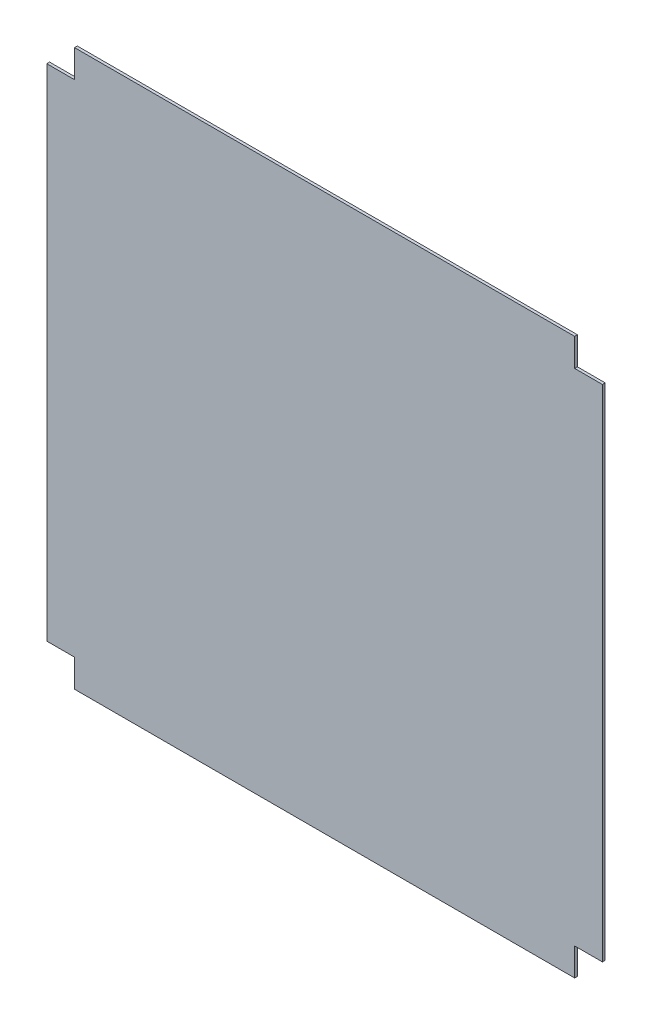
ISO-10303-21;
HEADER;
FILE_DESCRIPTION(('STEP AP214'),'2;1');
FILE_NAME('part.step','',(''),(''),'','','');
FILE_SCHEMA(('AUTOMOTIVE_DESIGN { 1 0 10303 214 1 1 1 1 }'));
ENDSEC;
DATA;
#1=APPLICATION_CONTEXT('core data for automotive mechanical design processes');
#2=APPLICATION_PROTOCOL_DEFINITION('international standard','automotive_design',2000,#1);
#3=PRODUCT_CONTEXT('',#1,'mechanical');
#4=PRODUCT('Part','Part','',(#3));
#5=PRODUCT_RELATED_PRODUCT_CATEGORY('part','',(#4));
#6=PRODUCT_DEFINITION_FORMATION('','',#4);
#7=PRODUCT_DEFINITION_CONTEXT('part definition',#1,'design');
#8=PRODUCT_DEFINITION('design','',#6,#7);
#9=PRODUCT_DEFINITION_SHAPE('','',#8);
#10=(LENGTH_UNIT() NAMED_UNIT(*) SI_UNIT(.MILLI.,.METRE.));
#11=(NAMED_UNIT(*) PLANE_ANGLE_UNIT() SI_UNIT($,.RADIAN.));
#12=(NAMED_UNIT(*) SI_UNIT($,.STERADIAN.) SOLID_ANGLE_UNIT());
#13=UNCERTAINTY_MEASURE_WITH_UNIT(LENGTH_MEASURE(1.E-05),#10,'distance_accuracy_value','');
#14=(GEOMETRIC_REPRESENTATION_CONTEXT(3) GLOBAL_UNCERTAINTY_ASSIGNED_CONTEXT((#13)) GLOBAL_UNIT_ASSIGNED_CONTEXT((#10,
#11,#12)) REPRESENTATION_CONTEXT('',''));
#15=CARTESIAN_POINT('',(0.,0.,0.));
#16=DIRECTION('',(0.,0.,1.));
#17=DIRECTION('',(1.,0.,0.));
#18=AXIS2_PLACEMENT_3D('',#15,#16,#17);
#19=CARTESIAN_POINT('',(380.,0.,2.));
#20=DIRECTION('',(-1.,0.,0.));
#21=DIRECTION('',(0.,0.,1.));
#22=AXIS2_PLACEMENT_3D('',#19,#20,#21);
#23=PLANE('',#22);
#24=DIRECTION('',(0.,1.,0.));
#25=VECTOR('',#24,1.);
#26=CARTESIAN_POINT('',(380.,0.,0.));
#27=LINE('',#26,#25);
#28=CARTESIAN_POINT('',(380.,0.,0.));
#29=VERTEX_POINT('',#28);
#30=CARTESIAN_POINT('',(380.,20.0000000000094,0.));
#31=VERTEX_POINT('',#30);
#32=EDGE_CURVE('E169',#29,#31,#27,.T.);
#33=ORIENTED_EDGE('',*,*,#32,.T.);
#34=DIRECTION('',(0.,0.,-1.));
#35=VECTOR('',#34,1.);
#36=CARTESIAN_POINT('',(380.,20.0000000000094,2.));
#37=LINE('',#36,#35);
#38=CARTESIAN_POINT('',(380.,20.0000000000094,2.));
#39=VERTEX_POINT('',#38);
#40=EDGE_CURVE('E11',#39,#31,#37,.T.);
#41=ORIENTED_EDGE('',*,*,#40,.F.);
#42=DIRECTION('',(0.,1.,0.));
#43=VECTOR('',#42,1.);
#44=CARTESIAN_POINT('',(380.,0.,2.));
#45=LINE('',#44,#43);
#46=CARTESIAN_POINT('',(380.,0.,2.));
#47=VERTEX_POINT('',#46);
#48=EDGE_CURVE('E211',#47,#39,#45,.T.);
#49=ORIENTED_EDGE('',*,*,#48,.F.);
#50=DIRECTION('',(0.,0.,-1.));
#51=VECTOR('',#50,1.);
#52=CARTESIAN_POINT('',(380.,0.,2.));
#53=LINE('',#52,#51);
#54=EDGE_CURVE('E165',#47,#29,#53,.T.);
#55=ORIENTED_EDGE('',*,*,#54,.T.);
#56=EDGE_LOOP('',(#33,#41,#49,#55));
#57=FACE_BOUND('',#56,.T.);
#58=ADVANCED_FACE('F45',(#57),#23,.F.);
#59=CARTESIAN_POINT('',(0.,20.0000000000093,2.));
#60=DIRECTION('',(0.,1.,0.));
#61=DIRECTION('',(-1.,0.,0.));
#62=AXIS2_PLACEMENT_3D('',#59,#60,#61);
#63=PLANE('',#62);
#64=DIRECTION('',(1.,0.,0.));
#65=VECTOR('',#64,1.);
#66=CARTESIAN_POINT('',(0.,20.0000000000093,0.));
#67=LINE('',#66,#65);
#68=CARTESIAN_POINT('',(400.,20.0000000000094,0.));
#69=VERTEX_POINT('',#68);
#70=EDGE_CURVE('E173',#31,#69,#67,.T.);
#71=ORIENTED_EDGE('',*,*,#70,.T.);
#72=DIRECTION('',(0.,0.,-1.));
#73=VECTOR('',#72,1.);
#74=CARTESIAN_POINT('',(400.,20.0000000000094,2.));
#75=LINE('',#74,#73);
#76=CARTESIAN_POINT('',(400.,20.0000000000094,2.));
#77=VERTEX_POINT('',#76);
#78=EDGE_CURVE('E54',#77,#69,#75,.T.);
#79=ORIENTED_EDGE('',*,*,#78,.F.);
#80=DIRECTION('',(1.,0.,0.));
#81=VECTOR('',#80,1.);
#82=CARTESIAN_POINT('',(0.,20.0000000000093,2.));
#83=LINE('',#82,#81);
#84=EDGE_CURVE('E113',#39,#77,#83,.T.);
#85=ORIENTED_EDGE('',*,*,#84,.F.);
#86=ORIENTED_EDGE('',*,*,#40,.T.);
#87=EDGE_LOOP('',(#71,#79,#85,#86));
#88=FACE_BOUND('',#87,.T.);
#89=ADVANCED_FACE('F293',(#88),#63,.F.);
#90=CARTESIAN_POINT('',(400.,0.,2.));
#91=DIRECTION('',(-1.,0.,0.));
#92=DIRECTION('',(0.,0.,1.));
#93=AXIS2_PLACEMENT_3D('',#90,#91,#92);
#94=PLANE('',#93);
#95=DIRECTION('',(0.,1.,0.));
#96=VECTOR('',#95,1.);
#97=CARTESIAN_POINT('',(400.,0.,0.));
#98=LINE('',#97,#96);
#99=CARTESIAN_POINT('',(400.,380.000000000009,0.));
#100=VERTEX_POINT('',#99);
#101=EDGE_CURVE('E176',#69,#100,#98,.T.);
#102=ORIENTED_EDGE('',*,*,#101,.T.);
#103=DIRECTION('',(0.,0.,-1.));
#104=VECTOR('',#103,1.);
#105=CARTESIAN_POINT('',(400.,380.000000000009,2.));
#106=LINE('',#105,#104);
#107=CARTESIAN_POINT('',(400.,380.000000000009,2.));
#108=VERTEX_POINT('',#107);
#109=EDGE_CURVE('E233',#108,#100,#106,.T.);
#110=ORIENTED_EDGE('',*,*,#109,.F.);
#111=DIRECTION('',(0.,1.,0.));
#112=VECTOR('',#111,1.);
#113=CARTESIAN_POINT('',(400.,0.,2.));
#114=LINE('',#113,#112);
#115=EDGE_CURVE('E242',#77,#108,#114,.T.);
#116=ORIENTED_EDGE('',*,*,#115,.F.);
#117=ORIENTED_EDGE('',*,*,#78,.T.);
#118=EDGE_LOOP('',(#102,#110,#116,#117));
#119=FACE_BOUND('',#118,.T.);
#120=ADVANCED_FACE('F240',(#119),#94,.F.);
#121=CARTESIAN_POINT('',(0.,380.000000000009,2.));
#122=DIRECTION('',(0.,1.,0.));
#123=DIRECTION('',(0.,0.,1.));
#124=AXIS2_PLACEMENT_3D('',#121,#122,#123);
#125=PLANE('',#124);
#126=DIRECTION('',(1.,0.,0.));
#127=VECTOR('',#126,1.);
#128=CARTESIAN_POINT('',(0.,380.000000000009,0.));
#129=LINE('',#128,#127);
#130=CARTESIAN_POINT('',(380.,380.000000000009,0.));
#131=VERTEX_POINT('',#130);
#132=EDGE_CURVE('E180',#131,#100,#129,.T.);
#133=ORIENTED_EDGE('',*,*,#132,.F.);
#134=DIRECTION('',(0.,0.,-1.));
#135=VECTOR('',#134,1.);
#136=CARTESIAN_POINT('',(380.,380.000000000009,2.));
#137=LINE('',#136,#135);
#138=CARTESIAN_POINT('',(380.,380.000000000009,2.));
#139=VERTEX_POINT('',#138);
#140=EDGE_CURVE('E230',#139,#131,#137,.T.);
#141=ORIENTED_EDGE('',*,*,#140,.F.);
#142=DIRECTION('',(1.,0.,0.));
#143=VECTOR('',#142,1.);
#144=CARTESIAN_POINT('',(0.,380.000000000009,2.));
#145=LINE('',#144,#143);
#146=EDGE_CURVE('E253',#139,#108,#145,.T.);
#147=ORIENTED_EDGE('',*,*,#146,.T.);
#148=ORIENTED_EDGE('',*,*,#109,.T.);
#149=EDGE_LOOP('',(#133,#141,#147,#148));
#150=FACE_BOUND('',#149,.T.);
#151=ADVANCED_FACE('F249',(#150),#125,.T.);
#152=CARTESIAN_POINT('',(380.,0.,2.));
#153=DIRECTION('',(-1.,0.,0.));
#154=DIRECTION('',(0.,0.,1.));
#155=AXIS2_PLACEMENT_3D('',#152,#153,#154);
#156=PLANE('',#155);
#157=DIRECTION('',(0.,1.,0.));
#158=VECTOR('',#157,1.);
#159=CARTESIAN_POINT('',(380.,0.,0.));
#160=LINE('',#159,#158);
#161=CARTESIAN_POINT('',(380.,400.,0.));
#162=VERTEX_POINT('',#161);
#163=EDGE_CURVE('E184',#131,#162,#160,.T.);
#164=ORIENTED_EDGE('',*,*,#163,.T.);
#165=DIRECTION('',(0.,0.,-1.));
#166=VECTOR('',#165,1.);
#167=CARTESIAN_POINT('',(380.,400.,2.));
#168=LINE('',#167,#166);
#169=CARTESIAN_POINT('',(380.,400.,2.));
#170=VERTEX_POINT('',#169);
#171=EDGE_CURVE('E227',#170,#162,#168,.T.);
#172=ORIENTED_EDGE('',*,*,#171,.F.);
#173=DIRECTION('',(0.,1.,0.));
#174=VECTOR('',#173,1.);
#175=CARTESIAN_POINT('',(380.,0.,2.));
#176=LINE('',#175,#174);
#177=EDGE_CURVE('E255',#139,#170,#176,.T.);
#178=ORIENTED_EDGE('',*,*,#177,.F.);
#179=ORIENTED_EDGE('',*,*,#140,.T.);
#180=EDGE_LOOP('',(#164,#172,#178,#179));
#181=FACE_BOUND('',#180,.T.);
#182=ADVANCED_FACE('F304',(#181),#156,.F.);
#183=CARTESIAN_POINT('',(0.,400.,2.));
#184=DIRECTION('',(0.,1.,0.));
#185=DIRECTION('',(-1.,0.,0.));
#186=AXIS2_PLACEMENT_3D('',#183,#184,#185);
#187=PLANE('',#186);
#188=DIRECTION('',(1.,0.,0.));
#189=VECTOR('',#188,1.);
#190=CARTESIAN_POINT('',(0.,400.,0.));
#191=LINE('',#190,#189);
#192=CARTESIAN_POINT('',(20.,400.,0.));
#193=VERTEX_POINT('',#192);
#194=EDGE_CURVE('E188',#193,#162,#191,.T.);
#195=ORIENTED_EDGE('',*,*,#194,.F.);
#196=DIRECTION('',(0.,0.,-1.));
#197=VECTOR('',#196,1.);
#198=CARTESIAN_POINT('',(20.,400.,2.));
#199=LINE('',#198,#197);
#200=CARTESIAN_POINT('',(20.,400.,2.));
#201=VERTEX_POINT('',#200);
#202=EDGE_CURVE('E224',#201,#193,#199,.T.);
#203=ORIENTED_EDGE('',*,*,#202,.F.);
#204=DIRECTION('',(1.,0.,0.));
#205=VECTOR('',#204,1.);
#206=CARTESIAN_POINT('',(0.,400.,2.));
#207=LINE('',#206,#205);
#208=EDGE_CURVE('E259',#201,#170,#207,.T.);
#209=ORIENTED_EDGE('',*,*,#208,.T.);
#210=ORIENTED_EDGE('',*,*,#171,.T.);
#211=EDGE_LOOP('',(#195,#203,#209,#210));
#212=FACE_BOUND('',#211,.T.);
#213=ADVANCED_FACE('F307',(#212),#187,.T.);
#214=CARTESIAN_POINT('',(20.,0.,2.));
#215=DIRECTION('',(-1.,0.,0.));
#216=DIRECTION('',(0.,0.,1.));
#217=AXIS2_PLACEMENT_3D('',#214,#215,#216);
#218=PLANE('',#217);
#219=DIRECTION('',(0.,1.,0.));
#220=VECTOR('',#219,1.);
#221=CARTESIAN_POINT('',(20.,0.,0.));
#222=LINE('',#221,#220);
#223=CARTESIAN_POINT('',(20.,380.,0.));
#224=VERTEX_POINT('',#223);
#225=EDGE_CURVE('E192',#224,#193,#222,.T.);
#226=ORIENTED_EDGE('',*,*,#225,.F.);
#227=DIRECTION('',(0.,0.,-1.));
#228=VECTOR('',#227,1.);
#229=CARTESIAN_POINT('',(20.,380.,2.));
#230=LINE('',#229,#228);
#231=CARTESIAN_POINT('',(20.,380.,2.));
#232=VERTEX_POINT('',#231);
#233=EDGE_CURVE('E221',#232,#224,#230,.T.);
#234=ORIENTED_EDGE('',*,*,#233,.F.);
#235=DIRECTION('',(0.,1.,0.));
#236=VECTOR('',#235,1.);
#237=CARTESIAN_POINT('',(20.,0.,2.));
#238=LINE('',#237,#236);
#239=EDGE_CURVE('E267',#232,#201,#238,.T.);
#240=ORIENTED_EDGE('',*,*,#239,.T.);
#241=ORIENTED_EDGE('',*,*,#202,.T.);
#242=EDGE_LOOP('',(#226,#234,#240,#241));
#243=FACE_BOUND('',#242,.T.);
#244=ADVANCED_FACE('F311',(#243),#218,.T.);
#245=CARTESIAN_POINT('',(0.,380.,2.));
#246=DIRECTION('',(0.,1.,0.));
#247=DIRECTION('',(0.,0.,1.));
#248=AXIS2_PLACEMENT_3D('',#245,#246,#247);
#249=PLANE('',#248);
#250=DIRECTION('',(1.,0.,0.));
#251=VECTOR('',#250,1.);
#252=CARTESIAN_POINT('',(0.,380.,0.));
#253=LINE('',#252,#251);
#254=CARTESIAN_POINT('',(0.,380.,0.));
#255=VERTEX_POINT('',#254);
#256=EDGE_CURVE('E196',#255,#224,#253,.T.);
#257=ORIENTED_EDGE('',*,*,#256,.F.);
#258=DIRECTION('',(0.,0.,-1.));
#259=VECTOR('',#258,1.);
#260=CARTESIAN_POINT('',(0.,380.,2.));
#261=LINE('',#260,#259);
#262=CARTESIAN_POINT('',(0.,380.,2.));
#263=VERTEX_POINT('',#262);
#264=EDGE_CURVE('E218',#263,#255,#261,.T.);
#265=ORIENTED_EDGE('',*,*,#264,.F.);
#266=DIRECTION('',(1.,0.,0.));
#267=VECTOR('',#266,1.);
#268=CARTESIAN_POINT('',(0.,380.,2.));
#269=LINE('',#268,#267);
#270=EDGE_CURVE('E271',#263,#232,#269,.T.);
#271=ORIENTED_EDGE('',*,*,#270,.T.);
#272=ORIENTED_EDGE('',*,*,#233,.T.);
#273=EDGE_LOOP('',(#257,#265,#271,#272));
#274=FACE_BOUND('',#273,.T.);
#275=ADVANCED_FACE('F315',(#274),#249,.T.);
#276=CARTESIAN_POINT('',(0.,0.,2.));
#277=DIRECTION('',(-1.,0.,0.));
#278=DIRECTION('',(0.,0.,1.));
#279=AXIS2_PLACEMENT_3D('',#276,#277,#278);
#280=PLANE('',#279);
#281=DIRECTION('',(0.,1.,0.));
#282=VECTOR('',#281,1.);
#283=CARTESIAN_POINT('',(0.,0.,0.));
#284=LINE('',#283,#282);
#285=CARTESIAN_POINT('',(0.,20.,0.));
#286=VERTEX_POINT('',#285);
#287=EDGE_CURVE('E200',#286,#255,#284,.T.);
#288=ORIENTED_EDGE('',*,*,#287,.F.);
#289=DIRECTION('',(0.,0.,-1.));
#290=VECTOR('',#289,1.);
#291=CARTESIAN_POINT('',(0.,20.,2.));
#292=LINE('',#291,#290);
#293=CARTESIAN_POINT('',(0.,20.,2.));
#294=VERTEX_POINT('',#293);
#295=EDGE_CURVE('E159',#294,#286,#292,.T.);
#296=ORIENTED_EDGE('',*,*,#295,.F.);
#297=DIRECTION('',(0.,1.,0.));
#298=VECTOR('',#297,1.);
#299=CARTESIAN_POINT('',(0.,0.,2.));
#300=LINE('',#299,#298);
#301=EDGE_CURVE('E146',#294,#263,#300,.T.);
#302=ORIENTED_EDGE('',*,*,#301,.T.);
#303=ORIENTED_EDGE('',*,*,#264,.T.);
#304=EDGE_LOOP('',(#288,#296,#302,#303));
#305=FACE_BOUND('',#304,.T.);
#306=ADVANCED_FACE('F277',(#305),#280,.T.);
#307=CARTESIAN_POINT('',(0.,20.,2.));
#308=DIRECTION('',(0.,1.,0.));
#309=DIRECTION('',(-1.,0.,0.));
#310=AXIS2_PLACEMENT_3D('',#307,#308,#309);
#311=PLANE('',#310);
#312=DIRECTION('',(1.,0.,0.));
#313=VECTOR('',#312,1.);
#314=CARTESIAN_POINT('',(0.,20.,0.));
#315=LINE('',#314,#313);
#316=CARTESIAN_POINT('',(20.,20.,0.));
#317=VERTEX_POINT('',#316);
#318=EDGE_CURVE('E154',#286,#317,#315,.T.);
#319=ORIENTED_EDGE('',*,*,#318,.T.);
#320=DIRECTION('',(0.,0.,-1.));
#321=VECTOR('',#320,1.);
#322=CARTESIAN_POINT('',(20.,20.,2.));
#323=LINE('',#322,#321);
#324=CARTESIAN_POINT('',(20.,20.,2.));
#325=VERTEX_POINT('',#324);
#326=EDGE_CURVE('E151',#325,#317,#323,.T.);
#327=ORIENTED_EDGE('',*,*,#326,.F.);
#328=DIRECTION('',(1.,0.,0.));
#329=VECTOR('',#328,1.);
#330=CARTESIAN_POINT('',(0.,20.,2.));
#331=LINE('',#330,#329);
#332=EDGE_CURVE('E139',#294,#325,#331,.T.);
#333=ORIENTED_EDGE('',*,*,#332,.F.);
#334=ORIENTED_EDGE('',*,*,#295,.T.);
#335=EDGE_LOOP('',(#319,#327,#333,#334));
#336=FACE_BOUND('',#335,.T.);
#337=ADVANCED_FACE('F152',(#336),#311,.F.);
#338=CARTESIAN_POINT('',(20.,0.,2.));
#339=DIRECTION('',(-1.,0.,0.));
#340=DIRECTION('',(0.,0.,1.));
#341=AXIS2_PLACEMENT_3D('',#338,#339,#340);
#342=PLANE('',#341);
#343=DIRECTION('',(0.,1.,0.));
#344=VECTOR('',#343,1.);
#345=CARTESIAN_POINT('',(20.,0.,0.));
#346=LINE('',#345,#344);
#347=CARTESIAN_POINT('',(20.,0.,0.));
#348=VERTEX_POINT('',#347);
#349=EDGE_CURVE('E206',#348,#317,#346,.T.);
#350=ORIENTED_EDGE('',*,*,#349,.F.);
#351=DIRECTION('',(0.,0.,-1.));
#352=VECTOR('',#351,1.);
#353=CARTESIAN_POINT('',(20.,0.,2.));
#354=LINE('',#353,#352);
#355=CARTESIAN_POINT('',(20.,0.,2.));
#356=VERTEX_POINT('',#355);
#357=EDGE_CURVE('E102',#356,#348,#354,.T.);
#358=ORIENTED_EDGE('',*,*,#357,.F.);
#359=DIRECTION('',(0.,1.,0.));
#360=VECTOR('',#359,1.);
#361=CARTESIAN_POINT('',(20.,0.,2.));
#362=LINE('',#361,#360);
#363=EDGE_CURVE('E143',#356,#325,#362,.T.);
#364=ORIENTED_EDGE('',*,*,#363,.T.);
#365=ORIENTED_EDGE('',*,*,#326,.T.);
#366=EDGE_LOOP('',(#350,#358,#364,#365));
#367=FACE_BOUND('',#366,.T.);
#368=ADVANCED_FACE('F161',(#367),#342,.T.);
#369=CARTESIAN_POINT('',(0.,0.,2.));
#370=DIRECTION('',(0.,1.,0.));
#371=DIRECTION('',(-1.,0.,0.));
#372=AXIS2_PLACEMENT_3D('',#369,#370,#371);
#373=PLANE('',#372);
#374=DIRECTION('',(1.,0.,0.));
#375=VECTOR('',#374,1.);
#376=CARTESIAN_POINT('',(0.,0.,0.));
#377=LINE('',#376,#375);
#378=EDGE_CURVE('E105',#348,#29,#377,.T.);
#379=ORIENTED_EDGE('',*,*,#378,.T.);
#380=ORIENTED_EDGE('',*,*,#54,.F.);
#381=DIRECTION('',(1.,0.,0.));
#382=VECTOR('',#381,1.);
#383=CARTESIAN_POINT('',(0.,0.,2.));
#384=LINE('',#383,#382);
#385=EDGE_CURVE('E62',#356,#47,#384,.T.);
#386=ORIENTED_EDGE('',*,*,#385,.F.);
#387=ORIENTED_EDGE('',*,*,#357,.T.);
#388=EDGE_LOOP('',(#379,#380,#386,#387));
#389=FACE_BOUND('',#388,.T.);
#390=ADVANCED_FACE('F282',(#389),#373,.F.);
#391=CARTESIAN_POINT('',(0.,0.,2.));
#392=DIRECTION('',(0.,0.,1.));
#393=DIRECTION('',(1.,0.,0.));
#394=AXIS2_PLACEMENT_3D('',#391,#392,#393);
#395=PLANE('',#394);
#396=ORIENTED_EDGE('',*,*,#48,.T.);
#397=ORIENTED_EDGE('',*,*,#84,.T.);
#398=ORIENTED_EDGE('',*,*,#115,.T.);
#399=ORIENTED_EDGE('',*,*,#146,.F.);
#400=ORIENTED_EDGE('',*,*,#177,.T.);
#401=ORIENTED_EDGE('',*,*,#208,.F.);
#402=ORIENTED_EDGE('',*,*,#239,.F.);
#403=ORIENTED_EDGE('',*,*,#270,.F.);
#404=ORIENTED_EDGE('',*,*,#301,.F.);
#405=ORIENTED_EDGE('',*,*,#332,.T.);
#406=ORIENTED_EDGE('',*,*,#363,.F.);
#407=ORIENTED_EDGE('',*,*,#385,.T.);
#408=EDGE_LOOP('',(#396,#397,#398,#399,#400,#401,#402,#403,#404,#405,#406,#407));
#409=FACE_BOUND('',#408,.T.);
#410=ADVANCED_FACE('F141',(#409),#395,.T.);
#411=CARTESIAN_POINT('',(0.,0.,0.));
#412=DIRECTION('',(0.,0.,1.));
#413=DIRECTION('',(1.,0.,0.));
#414=AXIS2_PLACEMENT_3D('',#411,#412,#413);
#415=PLANE('',#414);
#416=ORIENTED_EDGE('',*,*,#32,.F.);
#417=ORIENTED_EDGE('',*,*,#378,.F.);
#418=ORIENTED_EDGE('',*,*,#349,.T.);
#419=ORIENTED_EDGE('',*,*,#318,.F.);
#420=ORIENTED_EDGE('',*,*,#287,.T.);
#421=ORIENTED_EDGE('',*,*,#256,.T.);
#422=ORIENTED_EDGE('',*,*,#225,.T.);
#423=ORIENTED_EDGE('',*,*,#194,.T.);
#424=ORIENTED_EDGE('',*,*,#163,.F.);
#425=ORIENTED_EDGE('',*,*,#132,.T.);
#426=ORIENTED_EDGE('',*,*,#101,.F.);
#427=ORIENTED_EDGE('',*,*,#70,.F.);
#428=EDGE_LOOP('',(#416,#417,#418,#419,#420,#421,#422,#423,#424,#425,#426,#427));
#429=FACE_BOUND('',#428,.T.);
#430=ADVANCED_FACE('F245',(#429),#415,.F.);
#431=CLOSED_SHELL('',(#58,#89,#120,#151,#182,#213,#244,#275,#306,#337,#368,#390,#410,#430));
#432=MANIFOLD_SOLID_BREP('B2',#431);
#433=ADVANCED_BREP_SHAPE_REPRESENTATION('',(#18,#432),#14);
#434=SHAPE_DEFINITION_REPRESENTATION(#9,#433);
ENDSEC;
END-ISO-10303-21;
